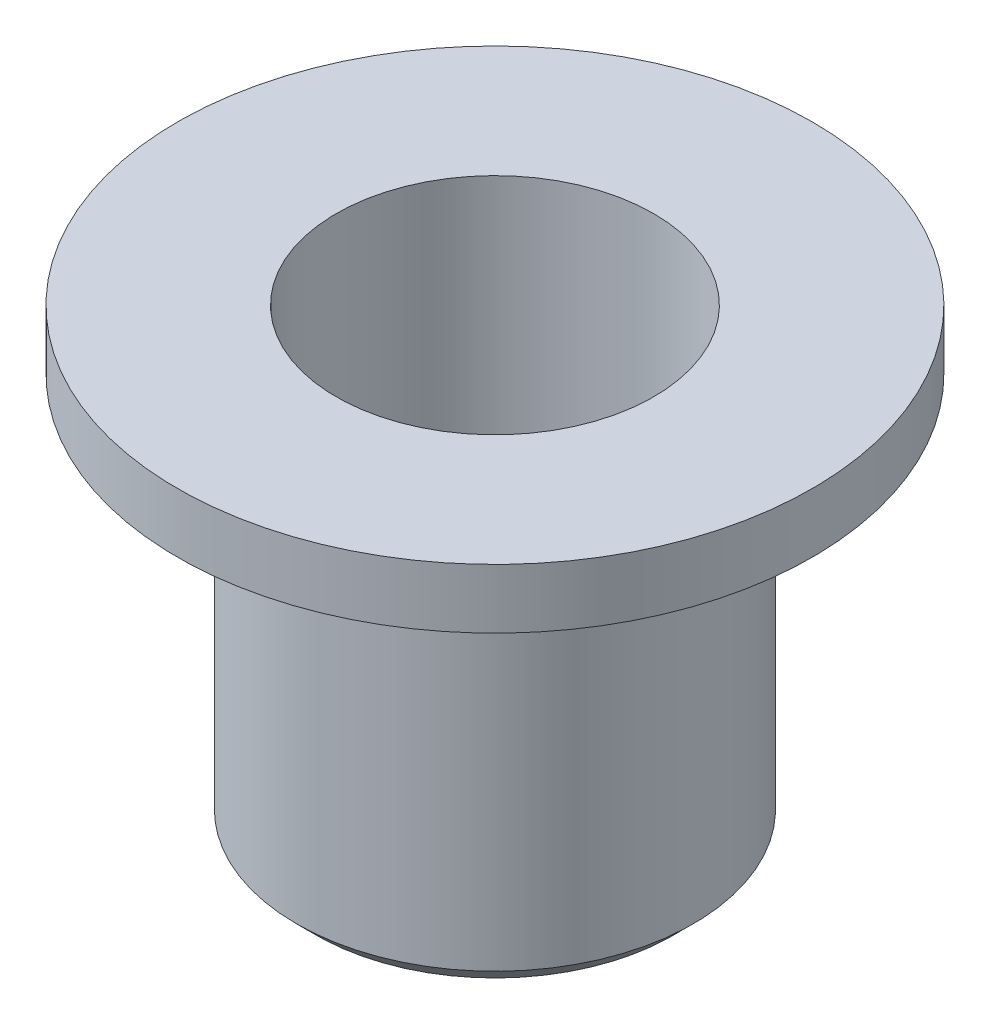
ISO-10303-21;
HEADER;
FILE_DESCRIPTION(('STEP AP214'),'2;1');
FILE_NAME('part.step','',(''),(''),'','','');
FILE_SCHEMA(('AUTOMOTIVE_DESIGN { 1 0 10303 214 1 1 1 1 }'));
ENDSEC;
DATA;
#1=APPLICATION_CONTEXT('core data for automotive mechanical design processes');
#2=APPLICATION_PROTOCOL_DEFINITION('international standard','automotive_design',2000,#1);
#3=PRODUCT_CONTEXT('',#1,'mechanical');
#4=PRODUCT('Part','Part','',(#3));
#5=PRODUCT_RELATED_PRODUCT_CATEGORY('part','',(#4));
#6=PRODUCT_DEFINITION_FORMATION('','',#4);
#7=PRODUCT_DEFINITION_CONTEXT('part definition',#1,'design');
#8=PRODUCT_DEFINITION('design','',#6,#7);
#9=PRODUCT_DEFINITION_SHAPE('','',#8);
#10=(LENGTH_UNIT() NAMED_UNIT(*) SI_UNIT(.MILLI.,.METRE.));
#11=(NAMED_UNIT(*) PLANE_ANGLE_UNIT() SI_UNIT($,.RADIAN.));
#12=(NAMED_UNIT(*) SI_UNIT($,.STERADIAN.) SOLID_ANGLE_UNIT());
#13=UNCERTAINTY_MEASURE_WITH_UNIT(LENGTH_MEASURE(1.E-05),#10,'distance_accuracy_value','');
#14=(GEOMETRIC_REPRESENTATION_CONTEXT(3) GLOBAL_UNCERTAINTY_ASSIGNED_CONTEXT((#13)) GLOBAL_UNIT_ASSIGNED_CONTEXT((#10,
#11,#12)) REPRESENTATION_CONTEXT('',''));
#15=CARTESIAN_POINT('',(0.,0.,0.));
#16=DIRECTION('',(0.,0.,1.));
#17=DIRECTION('',(1.,0.,0.));
#18=AXIS2_PLACEMENT_3D('',#15,#16,#17);
#19=CARTESIAN_POINT('',(0.,0.,0.));
#20=DIRECTION('',(0.,-1.,0.));
#21=DIRECTION('',(0.,0.,-1.));
#22=AXIS2_PLACEMENT_3D('',#19,#20,#21);
#23=CYLINDRICAL_SURFACE('',#22,4.);
#24=CARTESIAN_POINT('',(0.,0.,0.));
#25=DIRECTION('',(0.,-1.,0.));
#26=DIRECTION('',(0.,0.,-1.));
#27=AXIS2_PLACEMENT_3D('',#24,#25,#26);
#28=CIRCLE('',#27,4.);
#29=CARTESIAN_POINT('',(0.,0.,-4.));
#30=VERTEX_POINT('',#29);
#31=EDGE_CURVE('E10',#30,#30,#28,.T.);
#32=ORIENTED_EDGE('',*,*,#31,.T.);
#33=EDGE_LOOP('',(#32));
#34=FACE_BOUND('',#33,.T.);
#35=CARTESIAN_POINT('',(0.,11.5,0.));
#36=DIRECTION('',(0.,-1.,0.));
#37=DIRECTION('',(0.,0.,-1.));
#38=AXIS2_PLACEMENT_3D('',#35,#36,#37);
#39=CIRCLE('',#38,4.);
#40=CARTESIAN_POINT('',(0.,11.5,-4.));
#41=VERTEX_POINT('',#40);
#42=EDGE_CURVE('E58',#41,#41,#39,.T.);
#43=ORIENTED_EDGE('',*,*,#42,.F.);
#44=EDGE_LOOP('',(#43));
#45=FACE_BOUND('',#44,.T.);
#46=ADVANCED_FACE('F33',(#34,#45),#23,.F.);
#47=CARTESIAN_POINT('',(4.,0.,0.));
#48=DIRECTION('',(0.,-1.,0.));
#49=DIRECTION('',(0.,0.,-1.));
#50=AXIS2_PLACEMENT_3D('',#47,#48,#49);
#51=PLANE('',#50);
#52=CARTESIAN_POINT('',(0.,0.,0.));
#53=DIRECTION('',(0.,-1.,0.));
#54=DIRECTION('',(0.,0.,-1.));
#55=AXIS2_PLACEMENT_3D('',#52,#53,#54);
#56=CIRCLE('',#55,4.5);
#57=CARTESIAN_POINT('',(0.,0.,-4.5));
#58=VERTEX_POINT('',#57);
#59=EDGE_CURVE('E39',#58,#58,#56,.T.);
#60=ORIENTED_EDGE('',*,*,#59,.T.);
#61=EDGE_LOOP('',(#60));
#62=FACE_BOUND('',#61,.T.);
#63=ORIENTED_EDGE('',*,*,#31,.F.);
#64=EDGE_LOOP('',(#63));
#65=FACE_BOUND('',#64,.T.);
#66=ADVANCED_FACE('F66',(#62,#65),#51,.T.);
#67=CARTESIAN_POINT('',(0.,0.,0.));
#68=DIRECTION('',(0.,1.,0.));
#69=DIRECTION('',(0.,0.,1.));
#70=AXIS2_PLACEMENT_3D('',#67,#68,#69);
#71=CONICAL_SURFACE('',#70,4.5,0.785398163397449);
#72=CARTESIAN_POINT('',(0.,0.5,0.));
#73=DIRECTION('',(0.,-1.,0.));
#74=DIRECTION('',(0.,0.,-1.));
#75=AXIS2_PLACEMENT_3D('',#72,#73,#74);
#76=CIRCLE('',#75,5.);
#77=CARTESIAN_POINT('',(0.,0.5,-5.));
#78=VERTEX_POINT('',#77);
#79=EDGE_CURVE('E43',#78,#78,#76,.T.);
#80=ORIENTED_EDGE('',*,*,#79,.T.);
#81=EDGE_LOOP('',(#80));
#82=FACE_BOUND('',#81,.T.);
#83=ORIENTED_EDGE('',*,*,#59,.F.);
#84=EDGE_LOOP('',(#83));
#85=FACE_BOUND('',#84,.T.);
#86=ADVANCED_FACE('F70',(#82,#85),#71,.T.);
#87=CARTESIAN_POINT('',(0.,0.,0.));
#88=DIRECTION('',(0.,-1.,0.));
#89=DIRECTION('',(0.,0.,-1.));
#90=AXIS2_PLACEMENT_3D('',#87,#88,#89);
#91=CYLINDRICAL_SURFACE('',#90,5.);
#92=CARTESIAN_POINT('',(0.,10.,0.));
#93=DIRECTION('',(0.,-1.,0.));
#94=DIRECTION('',(0.,0.,-1.));
#95=AXIS2_PLACEMENT_3D('',#92,#93,#94);
#96=CIRCLE('',#95,5.);
#97=CARTESIAN_POINT('',(0.,10.,-5.));
#98=VERTEX_POINT('',#97);
#99=EDGE_CURVE('E47',#98,#98,#96,.T.);
#100=ORIENTED_EDGE('',*,*,#99,.T.);
#101=EDGE_LOOP('',(#100));
#102=FACE_BOUND('',#101,.T.);
#103=ORIENTED_EDGE('',*,*,#79,.F.);
#104=EDGE_LOOP('',(#103));
#105=FACE_BOUND('',#104,.T.);
#106=ADVANCED_FACE('F74',(#102,#105),#91,.T.);
#107=CARTESIAN_POINT('',(5.,10.,0.));
#108=DIRECTION('',(0.,-1.,0.));
#109=DIRECTION('',(0.,0.,-1.));
#110=AXIS2_PLACEMENT_3D('',#107,#108,#109);
#111=PLANE('',#110);
#112=CARTESIAN_POINT('',(0.,10.,0.));
#113=DIRECTION('',(0.,-1.,0.));
#114=DIRECTION('',(0.,0.,-1.));
#115=AXIS2_PLACEMENT_3D('',#112,#113,#114);
#116=CIRCLE('',#115,8.);
#117=CARTESIAN_POINT('',(0.,10.,-8.));
#118=VERTEX_POINT('',#117);
#119=EDGE_CURVE('E52',#118,#118,#116,.T.);
#120=ORIENTED_EDGE('',*,*,#119,.T.);
#121=EDGE_LOOP('',(#120));
#122=FACE_BOUND('',#121,.T.);
#123=ORIENTED_EDGE('',*,*,#99,.F.);
#124=EDGE_LOOP('',(#123));
#125=FACE_BOUND('',#124,.T.);
#126=ADVANCED_FACE('F81',(#122,#125),#111,.T.);
#127=CARTESIAN_POINT('',(0.,0.,0.));
#128=DIRECTION('',(0.,-1.,0.));
#129=DIRECTION('',(0.,0.,-1.));
#130=AXIS2_PLACEMENT_3D('',#127,#128,#129);
#131=CYLINDRICAL_SURFACE('',#130,8.);
#132=CARTESIAN_POINT('',(0.,11.5,0.));
#133=DIRECTION('',(0.,-1.,0.));
#134=DIRECTION('',(0.,0.,-1.));
#135=AXIS2_PLACEMENT_3D('',#132,#133,#134);
#136=CIRCLE('',#135,8.);
#137=CARTESIAN_POINT('',(0.,11.5,-8.));
#138=VERTEX_POINT('',#137);
#139=EDGE_CURVE('E55',#138,#138,#136,.T.);
#140=ORIENTED_EDGE('',*,*,#139,.T.);
#141=EDGE_LOOP('',(#140));
#142=FACE_BOUND('',#141,.T.);
#143=ORIENTED_EDGE('',*,*,#119,.F.);
#144=EDGE_LOOP('',(#143));
#145=FACE_BOUND('',#144,.T.);
#146=ADVANCED_FACE('F85',(#142,#145),#131,.T.);
#147=CARTESIAN_POINT('',(8.,11.5,0.));
#148=DIRECTION('',(0.,1.,0.));
#149=DIRECTION('',(0.,0.,1.));
#150=AXIS2_PLACEMENT_3D('',#147,#148,#149);
#151=PLANE('',#150);
#152=ORIENTED_EDGE('',*,*,#42,.T.);
#153=EDGE_LOOP('',(#152));
#154=FACE_BOUND('',#153,.T.);
#155=ORIENTED_EDGE('',*,*,#139,.F.);
#156=EDGE_LOOP('',(#155));
#157=FACE_BOUND('',#156,.T.);
#158=ADVANCED_FACE('F62',(#154,#157),#151,.T.);
#159=CLOSED_SHELL('',(#46,#66,#86,#106,#126,#146,#158));
#160=MANIFOLD_SOLID_BREP('B2',#159);
#161=ADVANCED_BREP_SHAPE_REPRESENTATION('',(#18,#160),#14);
#162=SHAPE_DEFINITION_REPRESENTATION(#9,#161);
ENDSEC;
END-ISO-10303-21;
